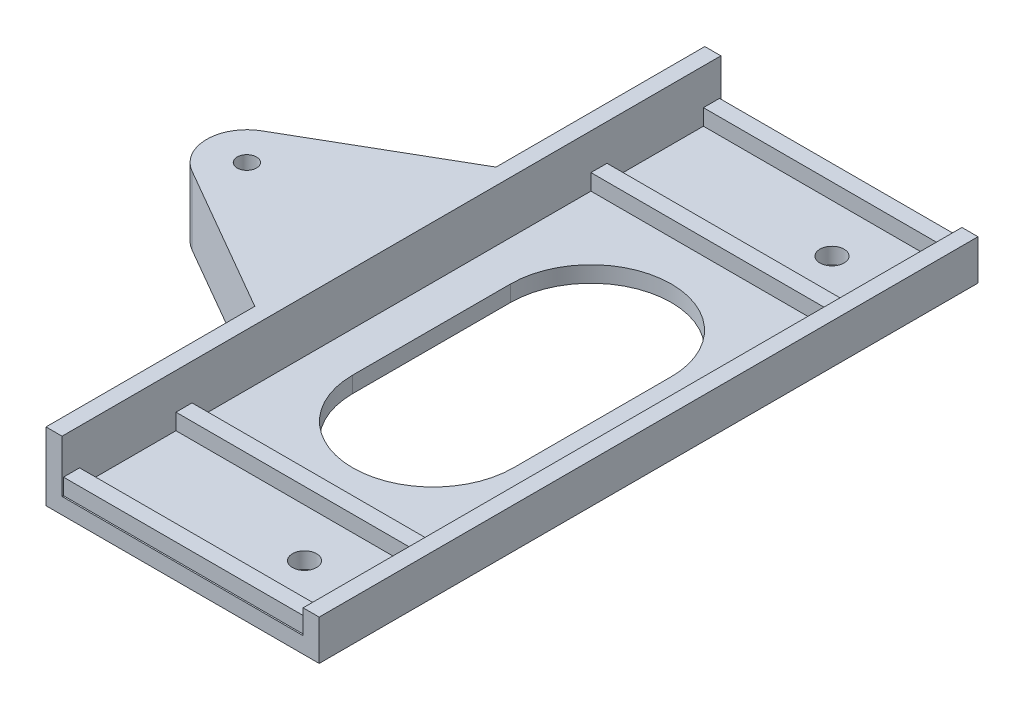
ISO-10303-21;
HEADER;
FILE_DESCRIPTION(('STEP AP214'),'2;1');
FILE_NAME('part.step','',(''),(''),'','','');
FILE_SCHEMA(('AUTOMOTIVE_DESIGN { 1 0 10303 214 1 1 1 1 }'));
ENDSEC;
DATA;
#1=APPLICATION_CONTEXT('core data for automotive mechanical design processes');
#2=APPLICATION_PROTOCOL_DEFINITION('international standard','automotive_design',2000,#1);
#3=PRODUCT_CONTEXT('',#1,'mechanical');
#4=PRODUCT('Part','Part','',(#3));
#5=PRODUCT_RELATED_PRODUCT_CATEGORY('part','',(#4));
#6=PRODUCT_DEFINITION_FORMATION('','',#4);
#7=PRODUCT_DEFINITION_CONTEXT('part definition',#1,'design');
#8=PRODUCT_DEFINITION('design','',#6,#7);
#9=PRODUCT_DEFINITION_SHAPE('','',#8);
#10=(LENGTH_UNIT() NAMED_UNIT(*) SI_UNIT(.MILLI.,.METRE.));
#11=(NAMED_UNIT(*) PLANE_ANGLE_UNIT() SI_UNIT($,.RADIAN.));
#12=(NAMED_UNIT(*) SI_UNIT($,.STERADIAN.) SOLID_ANGLE_UNIT());
#13=UNCERTAINTY_MEASURE_WITH_UNIT(LENGTH_MEASURE(1.E-05),#10,'distance_accuracy_value','');
#14=(GEOMETRIC_REPRESENTATION_CONTEXT(3) GLOBAL_UNCERTAINTY_ASSIGNED_CONTEXT((#13)) GLOBAL_UNIT_ASSIGNED_CONTEXT((#10,
#11,#12)) REPRESENTATION_CONTEXT('',''));
#15=CARTESIAN_POINT('',(0.,0.,0.));
#16=DIRECTION('',(0.,0.,1.));
#17=DIRECTION('',(1.,0.,0.));
#18=AXIS2_PLACEMENT_3D('',#15,#16,#17);
#19=CARTESIAN_POINT('',(-32.,0.,41.));
#20=DIRECTION('',(-1.,0.,0.));
#21=DIRECTION('',(0.,0.,1.));
#22=AXIS2_PLACEMENT_3D('',#19,#20,#21);
#23=PLANE('',#22);
#24=DIRECTION('',(0.,0.,-1.));
#25=VECTOR('',#24,1.);
#26=CARTESIAN_POINT('',(-32.,-2.,41.));
#27=LINE('',#26,#25);
#28=CARTESIAN_POINT('',(-32.,-2.00000000000001,-15.0111069989302));
#29=VERTEX_POINT('',#28);
#30=CARTESIAN_POINT('',(-32.,-2.,-41.));
#31=VERTEX_POINT('',#30);
#32=EDGE_CURVE('E269',#29,#31,#27,.T.);
#33=ORIENTED_EDGE('',*,*,#32,.F.);
#34=DIRECTION('',(0.,1.,0.));
#35=VECTOR('',#34,1.);
#36=CARTESIAN_POINT('',(-32.,-38.6378674779705,-15.0111069989302));
#37=LINE('',#36,#35);
#38=CARTESIAN_POINT('',(-32.,6.5,-15.0111069989302));
#39=VERTEX_POINT('',#38);
#40=EDGE_CURVE('E252',#29,#39,#37,.T.);
#41=ORIENTED_EDGE('',*,*,#40,.T.);
#42=DIRECTION('',(0.,0.,-1.));
#43=VECTOR('',#42,1.);
#44=CARTESIAN_POINT('',(-32.,6.5,41.));
#45=LINE('',#44,#43);
#46=CARTESIAN_POINT('',(-32.,6.5,-41.));
#47=VERTEX_POINT('',#46);
#48=EDGE_CURVE('E268',#39,#47,#45,.T.);
#49=ORIENTED_EDGE('',*,*,#48,.T.);
#50=DIRECTION('',(0.,1.,0.));
#51=VECTOR('',#50,1.);
#52=CARTESIAN_POINT('',(-32.,0.,-41.));
#53=LINE('',#52,#51);
#54=EDGE_CURVE('E329',#31,#47,#53,.T.);
#55=ORIENTED_EDGE('',*,*,#54,.F.);
#56=EDGE_LOOP('',(#33,#41,#49,#55));
#57=FACE_BOUND('',#56,.T.);
#58=ADVANCED_FACE('F32',(#57),#23,.T.);
#59=CARTESIAN_POINT('',(-30.,0.,41.));
#60=DIRECTION('',(-1.,0.,0.));
#61=DIRECTION('',(0.,0.,1.));
#62=AXIS2_PLACEMENT_3D('',#59,#60,#61);
#63=PLANE('',#62);
#64=DIRECTION('',(0.,-1.,0.));
#65=VECTOR('',#64,1.);
#66=CARTESIAN_POINT('',(-30.,2.,40.825));
#67=LINE('',#66,#65);
#68=CARTESIAN_POINT('',(-30.,2.,40.825));
#69=VERTEX_POINT('',#68);
#70=CARTESIAN_POINT('',(-30.,0.,40.825));
#71=VERTEX_POINT('',#70);
#72=EDGE_CURVE('E469',#69,#71,#67,.T.);
#73=ORIENTED_EDGE('',*,*,#72,.F.);
#74=DIRECTION('',(0.,0.,1.));
#75=VECTOR('',#74,1.);
#76=CARTESIAN_POINT('',(-30.,2.,40.825));
#77=LINE('',#76,#75);
#78=CARTESIAN_POINT('',(-30.,2.,38.825));
#79=VERTEX_POINT('',#78);
#80=EDGE_CURVE('E476',#79,#69,#77,.T.);
#81=ORIENTED_EDGE('',*,*,#80,.F.);
#82=DIRECTION('',(0.,-1.,0.));
#83=VECTOR('',#82,1.);
#84=CARTESIAN_POINT('',(-30.,2.,38.825));
#85=LINE('',#84,#83);
#86=CARTESIAN_POINT('',(-30.,0.,38.825));
#87=VERTEX_POINT('',#86);
#88=EDGE_CURVE('E475',#79,#87,#85,.T.);
#89=ORIENTED_EDGE('',*,*,#88,.T.);
#90=DIRECTION('',(0.,0.,-1.));
#91=VECTOR('',#90,1.);
#92=CARTESIAN_POINT('',(-30.,0.,41.));
#93=LINE('',#92,#91);
#94=CARTESIAN_POINT('',(-30.,0.,26.825));
#95=VERTEX_POINT('',#94);
#96=EDGE_CURVE('E359',#87,#95,#93,.T.);
#97=ORIENTED_EDGE('',*,*,#96,.T.);
#98=DIRECTION('',(0.,-1.,0.));
#99=VECTOR('',#98,1.);
#100=CARTESIAN_POINT('',(-30.,2.,26.825));
#101=LINE('',#100,#99);
#102=CARTESIAN_POINT('',(-30.,2.,26.825));
#103=VERTEX_POINT('',#102);
#104=EDGE_CURVE('E527',#103,#95,#101,.T.);
#105=ORIENTED_EDGE('',*,*,#104,.F.);
#106=DIRECTION('',(0.,0.,1.));
#107=VECTOR('',#106,1.);
#108=CARTESIAN_POINT('',(-30.,2.,26.825));
#109=LINE('',#108,#107);
#110=CARTESIAN_POINT('',(-30.,2.,24.825));
#111=VERTEX_POINT('',#110);
#112=EDGE_CURVE('E524',#111,#103,#109,.T.);
#113=ORIENTED_EDGE('',*,*,#112,.F.);
#114=DIRECTION('',(0.,-1.,0.));
#115=VECTOR('',#114,1.);
#116=CARTESIAN_POINT('',(-30.,2.,24.825));
#117=LINE('',#116,#115);
#118=CARTESIAN_POINT('',(-30.,0.,24.825));
#119=VERTEX_POINT('',#118);
#120=EDGE_CURVE('E534',#111,#119,#117,.T.);
#121=ORIENTED_EDGE('',*,*,#120,.T.);
#122=CARTESIAN_POINT('',(-30.,0.,-24.825));
#123=VERTEX_POINT('',#122);
#124=EDGE_CURVE('E402',#119,#123,#93,.T.);
#125=ORIENTED_EDGE('',*,*,#124,.T.);
#126=DIRECTION('',(0.,-1.,0.));
#127=VECTOR('',#126,1.);
#128=CARTESIAN_POINT('',(-30.,2.,-24.825));
#129=LINE('',#128,#127);
#130=CARTESIAN_POINT('',(-30.,2.,-24.825));
#131=VERTEX_POINT('',#130);
#132=EDGE_CURVE('E570',#131,#123,#129,.T.);
#133=ORIENTED_EDGE('',*,*,#132,.F.);
#134=DIRECTION('',(0.,0.,1.));
#135=VECTOR('',#134,1.);
#136=CARTESIAN_POINT('',(-30.,2.,-26.825));
#137=LINE('',#136,#135);
#138=CARTESIAN_POINT('',(-30.,2.,-26.825));
#139=VERTEX_POINT('',#138);
#140=EDGE_CURVE('E544',#139,#131,#137,.T.);
#141=ORIENTED_EDGE('',*,*,#140,.F.);
#142=DIRECTION('',(0.,-1.,0.));
#143=VECTOR('',#142,1.);
#144=CARTESIAN_POINT('',(-30.,2.,-26.825));
#145=LINE('',#144,#143);
#146=CARTESIAN_POINT('',(-30.,0.,-26.825));
#147=VERTEX_POINT('',#146);
#148=EDGE_CURVE('E557',#139,#147,#145,.T.);
#149=ORIENTED_EDGE('',*,*,#148,.T.);
#150=CARTESIAN_POINT('',(-30.,0.,-38.825));
#151=VERTEX_POINT('',#150);
#152=EDGE_CURVE('E360',#147,#151,#93,.T.);
#153=ORIENTED_EDGE('',*,*,#152,.T.);
#154=DIRECTION('',(0.,-1.,0.));
#155=VECTOR('',#154,1.);
#156=CARTESIAN_POINT('',(-30.,2.,-38.825));
#157=LINE('',#156,#155);
#158=CARTESIAN_POINT('',(-30.,2.,-38.825));
#159=VERTEX_POINT('',#158);
#160=EDGE_CURVE('E510',#159,#151,#157,.T.);
#161=ORIENTED_EDGE('',*,*,#160,.F.);
#162=DIRECTION('',(0.,0.,1.));
#163=VECTOR('',#162,1.);
#164=CARTESIAN_POINT('',(-30.,2.,-40.825));
#165=LINE('',#164,#163);
#166=CARTESIAN_POINT('',(-30.,2.,-40.825));
#167=VERTEX_POINT('',#166);
#168=EDGE_CURVE('E490',#167,#159,#165,.T.);
#169=ORIENTED_EDGE('',*,*,#168,.F.);
#170=DIRECTION('',(0.,-1.,0.));
#171=VECTOR('',#170,1.);
#172=CARTESIAN_POINT('',(-30.,2.,-40.825));
#173=LINE('',#172,#171);
#174=CARTESIAN_POINT('',(-30.,0.,-40.825));
#175=VERTEX_POINT('',#174);
#176=EDGE_CURVE('E399',#167,#175,#173,.T.);
#177=ORIENTED_EDGE('',*,*,#176,.T.);
#178=CARTESIAN_POINT('',(-30.,0.,-41.));
#179=VERTEX_POINT('',#178);
#180=EDGE_CURVE('E387',#175,#179,#93,.T.);
#181=ORIENTED_EDGE('',*,*,#180,.T.);
#182=DIRECTION('',(0.,1.,0.));
#183=VECTOR('',#182,1.);
#184=CARTESIAN_POINT('',(-30.,0.,-41.));
#185=LINE('',#184,#183);
#186=CARTESIAN_POINT('',(-30.,6.5,-41.));
#187=VERTEX_POINT('',#186);
#188=EDGE_CURVE('E388',#179,#187,#185,.T.);
#189=ORIENTED_EDGE('',*,*,#188,.T.);
#190=DIRECTION('',(0.,0.,-1.));
#191=VECTOR('',#190,1.);
#192=CARTESIAN_POINT('',(-30.,6.5,41.));
#193=LINE('',#192,#191);
#194=CARTESIAN_POINT('',(-30.,6.5,41.));
#195=VERTEX_POINT('',#194);
#196=EDGE_CURVE('E11',#195,#187,#193,.T.);
#197=ORIENTED_EDGE('',*,*,#196,.F.);
#198=DIRECTION('',(0.,1.,0.));
#199=VECTOR('',#198,1.);
#200=CARTESIAN_POINT('',(-30.,0.,41.));
#201=LINE('',#200,#199);
#202=CARTESIAN_POINT('',(-30.,0.,41.));
#203=VERTEX_POINT('',#202);
#204=EDGE_CURVE('E354',#203,#195,#201,.T.);
#205=ORIENTED_EDGE('',*,*,#204,.F.);
#206=EDGE_CURVE('E355',#203,#71,#93,.T.);
#207=ORIENTED_EDGE('',*,*,#206,.T.);
#208=EDGE_LOOP('',(#73,#81,#89,#97,#105,#113,#121,#125,#133,#141,#149,#153,#161,#169,#177,#181,
#189,#197,#205,#207));
#209=FACE_BOUND('',#208,.T.);
#210=ADVANCED_FACE('F34',(#209),#63,.F.);
#211=CARTESIAN_POINT('',(0.,3.,41.));
#212=DIRECTION('',(1.,0.,0.));
#213=DIRECTION('',(0.,1.,0.));
#214=AXIS2_PLACEMENT_3D('',#211,#212,#213);
#215=PLANE('',#214);
#216=DIRECTION('',(0.,-1.,0.));
#217=VECTOR('',#216,1.);
#218=CARTESIAN_POINT('',(0.,2.,40.825));
#219=LINE('',#218,#217);
#220=CARTESIAN_POINT('',(0.,2.,40.825));
#221=VERTEX_POINT('',#220);
#222=CARTESIAN_POINT('',(0.,0.,40.825));
#223=VERTEX_POINT('',#222);
#224=EDGE_CURVE('E487',#221,#223,#219,.T.);
#225=ORIENTED_EDGE('',*,*,#224,.T.);
#226=DIRECTION('',(0.,0.,-1.));
#227=VECTOR('',#226,1.);
#228=CARTESIAN_POINT('',(0.,0.,41.));
#229=LINE('',#228,#227);
#230=CARTESIAN_POINT('',(0.,0.,41.));
#231=VERTEX_POINT('',#230);
#232=EDGE_CURVE('E361',#231,#223,#229,.T.);
#233=ORIENTED_EDGE('',*,*,#232,.F.);
#234=DIRECTION('',(0.,-1.,0.));
#235=VECTOR('',#234,1.);
#236=CARTESIAN_POINT('',(0.,3.,41.));
#237=LINE('',#236,#235);
#238=CARTESIAN_POINT('',(0.,3.,41.));
#239=VERTEX_POINT('',#238);
#240=EDGE_CURVE('E378',#239,#231,#237,.T.);
#241=ORIENTED_EDGE('',*,*,#240,.F.);
#242=DIRECTION('',(0.,0.,-1.));
#243=VECTOR('',#242,1.);
#244=CARTESIAN_POINT('',(0.,3.,41.));
#245=LINE('',#244,#243);
#246=CARTESIAN_POINT('',(0.,3.,-41.));
#247=VERTEX_POINT('',#246);
#248=EDGE_CURVE('E364',#239,#247,#245,.T.);
#249=ORIENTED_EDGE('',*,*,#248,.T.);
#250=DIRECTION('',(0.,-1.,0.));
#251=VECTOR('',#250,1.);
#252=CARTESIAN_POINT('',(0.,3.,-41.));
#253=LINE('',#252,#251);
#254=CARTESIAN_POINT('',(0.,0.,-41.));
#255=VERTEX_POINT('',#254);
#256=EDGE_CURVE('E345',#247,#255,#253,.T.);
#257=ORIENTED_EDGE('',*,*,#256,.T.);
#258=CARTESIAN_POINT('',(0.,0.,-40.825));
#259=VERTEX_POINT('',#258);
#260=EDGE_CURVE('E358',#259,#255,#229,.T.);
#261=ORIENTED_EDGE('',*,*,#260,.F.);
#262=DIRECTION('',(0.,-1.,0.));
#263=VECTOR('',#262,1.);
#264=CARTESIAN_POINT('',(0.,2.,-40.825));
#265=LINE('',#264,#263);
#266=CARTESIAN_POINT('',(0.,2.,-40.825));
#267=VERTEX_POINT('',#266);
#268=EDGE_CURVE('E506',#267,#259,#265,.T.);
#269=ORIENTED_EDGE('',*,*,#268,.F.);
#270=DIRECTION('',(0.,0.,-1.));
#271=VECTOR('',#270,1.);
#272=CARTESIAN_POINT('',(0.,2.,-40.825));
#273=LINE('',#272,#271);
#274=CARTESIAN_POINT('',(0.,2.,-38.825));
#275=VERTEX_POINT('',#274);
#276=EDGE_CURVE('E496',#275,#267,#273,.T.);
#277=ORIENTED_EDGE('',*,*,#276,.F.);
#278=DIRECTION('',(0.,-1.,0.));
#279=VECTOR('',#278,1.);
#280=CARTESIAN_POINT('',(0.,2.,-38.825));
#281=LINE('',#280,#279);
#282=CARTESIAN_POINT('',(0.,0.,-38.825));
#283=VERTEX_POINT('',#282);
#284=EDGE_CURVE('E508',#275,#283,#281,.T.);
#285=ORIENTED_EDGE('',*,*,#284,.T.);
#286=CARTESIAN_POINT('',(0.,0.,-26.825));
#287=VERTEX_POINT('',#286);
#288=EDGE_CURVE('E366',#287,#283,#229,.T.);
#289=ORIENTED_EDGE('',*,*,#288,.F.);
#290=DIRECTION('',(0.,-1.,0.));
#291=VECTOR('',#290,1.);
#292=CARTESIAN_POINT('',(0.,2.,-26.825));
#293=LINE('',#292,#291);
#294=CARTESIAN_POINT('',(0.,2.,-26.825));
#295=VERTEX_POINT('',#294);
#296=EDGE_CURVE('E564',#295,#287,#293,.T.);
#297=ORIENTED_EDGE('',*,*,#296,.F.);
#298=DIRECTION('',(0.,0.,-1.));
#299=VECTOR('',#298,1.);
#300=CARTESIAN_POINT('',(0.,2.,-26.825));
#301=LINE('',#300,#299);
#302=CARTESIAN_POINT('',(0.,2.,-24.825));
#303=VERTEX_POINT('',#302);
#304=EDGE_CURVE('E551',#303,#295,#301,.T.);
#305=ORIENTED_EDGE('',*,*,#304,.F.);
#306=DIRECTION('',(0.,-1.,0.));
#307=VECTOR('',#306,1.);
#308=CARTESIAN_POINT('',(0.,2.,-24.825));
#309=LINE('',#308,#307);
#310=CARTESIAN_POINT('',(0.,0.,-24.825));
#311=VERTEX_POINT('',#310);
#312=EDGE_CURVE('E567',#303,#311,#309,.T.);
#313=ORIENTED_EDGE('',*,*,#312,.T.);
#314=CARTESIAN_POINT('',(0.,0.,24.825));
#315=VERTEX_POINT('',#314);
#316=EDGE_CURVE('E408',#315,#311,#229,.T.);
#317=ORIENTED_EDGE('',*,*,#316,.F.);
#318=DIRECTION('',(0.,-1.,0.));
#319=VECTOR('',#318,1.);
#320=CARTESIAN_POINT('',(0.,2.,24.825));
#321=LINE('',#320,#319);
#322=CARTESIAN_POINT('',(0.,2.,24.825));
#323=VERTEX_POINT('',#322);
#324=EDGE_CURVE('E537',#323,#315,#321,.T.);
#325=ORIENTED_EDGE('',*,*,#324,.F.);
#326=DIRECTION('',(0.,0.,-1.));
#327=VECTOR('',#326,1.);
#328=CARTESIAN_POINT('',(0.,2.,26.825));
#329=LINE('',#328,#327);
#330=CARTESIAN_POINT('',(0.,2.,26.825));
#331=VERTEX_POINT('',#330);
#332=EDGE_CURVE('E517',#331,#323,#329,.T.);
#333=ORIENTED_EDGE('',*,*,#332,.F.);
#334=DIRECTION('',(0.,-1.,0.));
#335=VECTOR('',#334,1.);
#336=CARTESIAN_POINT('',(0.,2.,26.825));
#337=LINE('',#336,#335);
#338=CARTESIAN_POINT('',(0.,0.,26.825));
#339=VERTEX_POINT('',#338);
#340=EDGE_CURVE('E540',#331,#339,#337,.T.);
#341=ORIENTED_EDGE('',*,*,#340,.T.);
#342=CARTESIAN_POINT('',(0.,0.,38.825));
#343=VERTEX_POINT('',#342);
#344=EDGE_CURVE('E365',#343,#339,#229,.T.);
#345=ORIENTED_EDGE('',*,*,#344,.F.);
#346=DIRECTION('',(0.,-1.,0.));
#347=VECTOR('',#346,1.);
#348=CARTESIAN_POINT('',(0.,2.,38.825));
#349=LINE('',#348,#347);
#350=CARTESIAN_POINT('',(0.,2.,38.825));
#351=VERTEX_POINT('',#350);
#352=EDGE_CURVE('E479',#351,#343,#349,.T.);
#353=ORIENTED_EDGE('',*,*,#352,.F.);
#354=DIRECTION('',(0.,0.,-1.));
#355=VECTOR('',#354,1.);
#356=CARTESIAN_POINT('',(0.,2.,40.825));
#357=LINE('',#356,#355);
#358=EDGE_CURVE('E600',#221,#351,#357,.T.);
#359=ORIENTED_EDGE('',*,*,#358,.F.);
#360=EDGE_LOOP('',(#225,#233,#241,#249,#257,#261,#269,#277,#285,#289,#297,#305,#313,#317,#325,
#333,#341,#345,#353,#359));
#361=FACE_BOUND('',#360,.T.);
#362=ADVANCED_FACE('F409',(#361),#215,.F.);
#363=CARTESIAN_POINT('',(0.,0.,41.));
#364=DIRECTION('',(0.,-1.,0.));
#365=DIRECTION('',(1.,0.,0.));
#366=AXIS2_PLACEMENT_3D('',#363,#364,#365);
#367=PLANE('',#366);
#368=DIRECTION('',(1.,0.,0.));
#369=VECTOR('',#368,1.);
#370=CARTESIAN_POINT('',(-30.,0.,40.825));
#371=LINE('',#370,#369);
#372=EDGE_CURVE('E462',#71,#223,#371,.T.);
#373=ORIENTED_EDGE('',*,*,#372,.F.);
#374=ORIENTED_EDGE('',*,*,#206,.F.);
#375=DIRECTION('',(-1.,0.,0.));
#376=VECTOR('',#375,1.);
#377=CARTESIAN_POINT('',(0.,0.,41.));
#378=LINE('',#377,#376);
#379=EDGE_CURVE('E385',#231,#203,#378,.T.);
#380=ORIENTED_EDGE('',*,*,#379,.F.);
#381=ORIENTED_EDGE('',*,*,#232,.T.);
#382=EDGE_LOOP('',(#373,#374,#380,#381));
#383=FACE_BOUND('',#382,.T.);
#384=ADVANCED_FACE('F444',(#383),#367,.F.);
#385=CARTESIAN_POINT('',(-8.,0.,32.825));
#386=DIRECTION('',(0.,1.,0.));
#387=DIRECTION('',(-1.,0.,0.));
#388=AXIS2_PLACEMENT_3D('',#385,#386,#387);
#389=CIRCLE('',#388,1.5);
#390=CARTESIAN_POINT('',(-9.5,0.,32.825));
#391=VERTEX_POINT('',#390);
#392=EDGE_CURVE('E577',#391,#391,#389,.T.);
#393=ORIENTED_EDGE('',*,*,#392,.F.);
#394=EDGE_LOOP('',(#393));
#395=FACE_BOUND('',#394,.T.);
#396=DIRECTION('',(-1.,0.,0.));
#397=VECTOR('',#396,1.);
#398=CARTESIAN_POINT('',(-30.,0.,38.825));
#399=LINE('',#398,#397);
#400=EDGE_CURVE('E466',#343,#87,#399,.T.);
#401=ORIENTED_EDGE('',*,*,#400,.F.);
#402=ORIENTED_EDGE('',*,*,#344,.T.);
#403=DIRECTION('',(1.,0.,0.));
#404=VECTOR('',#403,1.);
#405=CARTESIAN_POINT('',(-30.,0.,26.825));
#406=LINE('',#405,#404);
#407=EDGE_CURVE('E513',#95,#339,#406,.T.);
#408=ORIENTED_EDGE('',*,*,#407,.F.);
#409=ORIENTED_EDGE('',*,*,#96,.F.);
#410=EDGE_LOOP('',(#401,#402,#408,#409));
#411=FACE_BOUND('',#410,.T.);
#412=ADVANCED_FACE('F453',(#395,#411),#367,.F.);
#413=CARTESIAN_POINT('',(-8.,0.,-32.825));
#414=DIRECTION('',(0.,1.,0.));
#415=DIRECTION('',(1.,0.,0.));
#416=AXIS2_PLACEMENT_3D('',#413,#414,#415);
#417=CIRCLE('',#416,1.5);
#418=CARTESIAN_POINT('',(-6.5,0.,-32.825));
#419=VERTEX_POINT('',#418);
#420=EDGE_CURVE('E573',#419,#419,#417,.T.);
#421=ORIENTED_EDGE('',*,*,#420,.F.);
#422=EDGE_LOOP('',(#421));
#423=FACE_BOUND('',#422,.T.);
#424=DIRECTION('',(1.,0.,0.));
#425=VECTOR('',#424,1.);
#426=CARTESIAN_POINT('',(-30.,0.,-38.825));
#427=LINE('',#426,#425);
#428=EDGE_CURVE('E489',#151,#283,#427,.T.);
#429=ORIENTED_EDGE('',*,*,#428,.F.);
#430=ORIENTED_EDGE('',*,*,#152,.F.);
#431=DIRECTION('',(-1.,0.,0.));
#432=VECTOR('',#431,1.);
#433=CARTESIAN_POINT('',(-30.,0.,-26.825));
#434=LINE('',#433,#432);
#435=EDGE_CURVE('E548',#287,#147,#434,.T.);
#436=ORIENTED_EDGE('',*,*,#435,.F.);
#437=ORIENTED_EDGE('',*,*,#288,.T.);
#438=EDGE_LOOP('',(#429,#430,#436,#437));
#439=FACE_BOUND('',#438,.T.);
#440=ADVANCED_FACE('F448',(#423,#439),#367,.F.);
#441=DIRECTION('',(-1.,0.,0.));
#442=VECTOR('',#441,1.);
#443=CARTESIAN_POINT('',(-30.,0.,-40.825));
#444=LINE('',#443,#442);
#445=EDGE_CURVE('E405',#259,#175,#444,.T.);
#446=ORIENTED_EDGE('',*,*,#445,.F.);
#447=ORIENTED_EDGE('',*,*,#260,.T.);
#448=DIRECTION('',(-1.,0.,0.));
#449=VECTOR('',#448,1.);
#450=CARTESIAN_POINT('',(0.,0.,-41.));
#451=LINE('',#450,#449);
#452=EDGE_CURVE('E351',#255,#179,#451,.T.);
#453=ORIENTED_EDGE('',*,*,#452,.T.);
#454=ORIENTED_EDGE('',*,*,#180,.F.);
#455=EDGE_LOOP('',(#446,#447,#453,#454));
#456=FACE_BOUND('',#455,.T.);
#457=ADVANCED_FACE('F403',(#456),#367,.F.);
#458=DIRECTION('',(0.,0.,1.));
#459=VECTOR('',#458,1.);
#460=CARTESIAN_POINT('',(-25.,0.,-9.825));
#461=LINE('',#460,#459);
#462=CARTESIAN_POINT('',(-25.,0.,-9.82499999999999));
#463=VERTEX_POINT('',#462);
#464=CARTESIAN_POINT('',(-25.,0.,9.825));
#465=VERTEX_POINT('',#464);
#466=EDGE_CURVE('E620',#463,#465,#461,.T.);
#467=ORIENTED_EDGE('',*,*,#466,.F.);
#468=CARTESIAN_POINT('',(-15.,0.,-9.82499999999999));
#469=DIRECTION('',(0.,1.,0.));
#470=DIRECTION('',(-1.,0.,0.));
#471=AXIS2_PLACEMENT_3D('',#468,#469,#470);
#472=CIRCLE('',#471,10.);
#473=CARTESIAN_POINT('',(-5.,0.,-9.825));
#474=VERTEX_POINT('',#473);
#475=EDGE_CURVE('E57',#474,#463,#472,.T.);
#476=ORIENTED_EDGE('',*,*,#475,.F.);
#477=DIRECTION('',(0.,0.,-1.));
#478=VECTOR('',#477,1.);
#479=CARTESIAN_POINT('',(-5.,0.,-9.825));
#480=LINE('',#479,#478);
#481=CARTESIAN_POINT('',(-5.,0.,9.825));
#482=VERTEX_POINT('',#481);
#483=EDGE_CURVE('E613',#482,#474,#480,.T.);
#484=ORIENTED_EDGE('',*,*,#483,.F.);
#485=CARTESIAN_POINT('',(-15.,0.,9.82499999999999));
#486=DIRECTION('',(0.,1.,0.));
#487=DIRECTION('',(-1.,0.,0.));
#488=AXIS2_PLACEMENT_3D('',#485,#486,#487);
#489=CIRCLE('',#488,10.);
#490=EDGE_CURVE('E617',#465,#482,#489,.T.);
#491=ORIENTED_EDGE('',*,*,#490,.F.);
#492=EDGE_LOOP('',(#467,#476,#484,#491));
#493=FACE_BOUND('',#492,.T.);
#494=DIRECTION('',(-1.,0.,0.));
#495=VECTOR('',#494,1.);
#496=CARTESIAN_POINT('',(-30.,0.,24.825));
#497=LINE('',#496,#495);
#498=EDGE_CURVE('E518',#315,#119,#497,.T.);
#499=ORIENTED_EDGE('',*,*,#498,.F.);
#500=ORIENTED_EDGE('',*,*,#316,.T.);
#501=DIRECTION('',(1.,0.,0.));
#502=VECTOR('',#501,1.);
#503=CARTESIAN_POINT('',(-30.,0.,-24.825));
#504=LINE('',#503,#502);
#505=EDGE_CURVE('E543',#123,#311,#504,.T.);
#506=ORIENTED_EDGE('',*,*,#505,.F.);
#507=ORIENTED_EDGE('',*,*,#124,.F.);
#508=EDGE_LOOP('',(#499,#500,#506,#507));
#509=FACE_BOUND('',#508,.T.);
#510=ADVANCED_FACE('F438',(#493,#509),#367,.F.);
#511=CARTESIAN_POINT('',(-32.,6.5,41.));
#512=DIRECTION('',(0.,1.,0.));
#513=DIRECTION('',(0.,0.,1.));
#514=AXIS2_PLACEMENT_3D('',#511,#512,#513);
#515=PLANE('',#514);
#516=DIRECTION('',(1.,0.,0.));
#517=VECTOR('',#516,1.);
#518=CARTESIAN_POINT('',(-32.,6.5,-41.));
#519=LINE('',#518,#517);
#520=EDGE_CURVE('E324',#47,#187,#519,.T.);
#521=ORIENTED_EDGE('',*,*,#520,.F.);
#522=ORIENTED_EDGE('',*,*,#48,.F.);
#523=DIRECTION('',(-0.86602540378444,0.,0.499999999999998));
#524=VECTOR('',#523,1.);
#525=CARTESIAN_POINT('',(-50.5,6.5,-4.3301270189222));
#526=LINE('',#525,#524);
#527=CARTESIAN_POINT('',(-50.5,6.5,-4.3301270189222));
#528=VERTEX_POINT('',#527);
#529=EDGE_CURVE('E49',#39,#528,#526,.T.);
#530=ORIENTED_EDGE('',*,*,#529,.T.);
#531=CARTESIAN_POINT('',(-48.,6.5,0.));
#532=DIRECTION('',(0.,1.,0.));
#533=DIRECTION('',(0.,0.,1.));
#534=AXIS2_PLACEMENT_3D('',#531,#532,#533);
#535=CIRCLE('',#534,5.);
#536=CARTESIAN_POINT('',(-50.5,6.5,4.3301270189222));
#537=VERTEX_POINT('',#536);
#538=EDGE_CURVE('E304',#528,#537,#535,.T.);
#539=ORIENTED_EDGE('',*,*,#538,.T.);
#540=DIRECTION('',(0.86602540378444,0.,0.499999999999998));
#541=VECTOR('',#540,1.);
#542=CARTESIAN_POINT('',(-32.,6.5,15.0111069989302));
#543=LINE('',#542,#541);
#544=CARTESIAN_POINT('',(-32.,6.5,15.0111069989302));
#545=VERTEX_POINT('',#544);
#546=EDGE_CURVE('E286',#537,#545,#543,.T.);
#547=ORIENTED_EDGE('',*,*,#546,.T.);
#548=CARTESIAN_POINT('',(-32.,6.5,41.));
#549=VERTEX_POINT('',#548);
#550=EDGE_CURVE('E41',#549,#545,#45,.T.);
#551=ORIENTED_EDGE('',*,*,#550,.F.);
#552=DIRECTION('',(1.,0.,0.));
#553=VECTOR('',#552,1.);
#554=CARTESIAN_POINT('',(-32.,6.5,41.));
#555=LINE('',#554,#553);
#556=EDGE_CURVE('E585',#549,#195,#555,.T.);
#557=ORIENTED_EDGE('',*,*,#556,.T.);
#558=ORIENTED_EDGE('',*,*,#196,.T.);
#559=EDGE_LOOP('',(#521,#522,#530,#539,#547,#551,#557,#558));
#560=FACE_BOUND('',#559,.T.);
#561=CARTESIAN_POINT('',(-48.,6.5,0.));
#562=DIRECTION('',(0.,1.,0.));
#563=DIRECTION('',(0.,0.,1.));
#564=AXIS2_PLACEMENT_3D('',#561,#562,#563);
#565=CIRCLE('',#564,1.2);
#566=CARTESIAN_POINT('',(-48.,6.5,1.2));
#567=VERTEX_POINT('',#566);
#568=EDGE_CURVE('E260',#567,#567,#565,.T.);
#569=ORIENTED_EDGE('',*,*,#568,.F.);
#570=EDGE_LOOP('',(#569));
#571=FACE_BOUND('',#570,.T.);
#572=ADVANCED_FACE('F321',(#560,#571),#515,.T.);
#573=DIRECTION('',(0.,1.,0.));
#574=VECTOR('',#573,1.);
#575=CARTESIAN_POINT('',(-32.,-38.6378674779705,15.0111069989302));
#576=LINE('',#575,#574);
#577=CARTESIAN_POINT('',(-32.,-2.00000000000001,15.0111069989302));
#578=VERTEX_POINT('',#577);
#579=EDGE_CURVE('E246',#578,#545,#576,.T.);
#580=ORIENTED_EDGE('',*,*,#579,.F.);
#581=CARTESIAN_POINT('',(-32.,-2.,41.));
#582=VERTEX_POINT('',#581);
#583=EDGE_CURVE('E258',#582,#578,#27,.T.);
#584=ORIENTED_EDGE('',*,*,#583,.F.);
#585=DIRECTION('',(0.,1.,0.));
#586=VECTOR('',#585,1.);
#587=CARTESIAN_POINT('',(-32.,0.,41.));
#588=LINE('',#587,#586);
#589=EDGE_CURVE('E380',#582,#549,#588,.T.);
#590=ORIENTED_EDGE('',*,*,#589,.T.);
#591=ORIENTED_EDGE('',*,*,#550,.T.);
#592=EDGE_LOOP('',(#580,#584,#590,#591));
#593=FACE_BOUND('',#592,.T.);
#594=ADVANCED_FACE('F256',(#593),#23,.T.);
#595=CARTESIAN_POINT('',(0.,-2.,41.));
#596=DIRECTION('',(0.,-1.,0.));
#597=DIRECTION('',(1.,0.,0.));
#598=AXIS2_PLACEMENT_3D('',#595,#596,#597);
#599=PLANE('',#598);
#600=CARTESIAN_POINT('',(-15.,-2.00000000000001,-9.82499999999999));
#601=DIRECTION('',(0.,1.,0.));
#602=DIRECTION('',(-1.,0.,0.));
#603=AXIS2_PLACEMENT_3D('',#600,#601,#602);
#604=CIRCLE('',#603,10.);
#605=CARTESIAN_POINT('',(-5.,-2.00000000000001,-9.825));
#606=VERTEX_POINT('',#605);
#607=CARTESIAN_POINT('',(-25.,-2.00000000000001,-9.825));
#608=VERTEX_POINT('',#607);
#609=EDGE_CURVE('E616',#606,#608,#604,.T.);
#610=ORIENTED_EDGE('',*,*,#609,.T.);
#611=DIRECTION('',(0.,0.,1.));
#612=VECTOR('',#611,1.);
#613=CARTESIAN_POINT('',(-25.,-2.00000000000001,-9.825));
#614=LINE('',#613,#612);
#615=CARTESIAN_POINT('',(-25.,-2.,9.82499999999999));
#616=VERTEX_POINT('',#615);
#617=EDGE_CURVE('E629',#608,#616,#614,.T.);
#618=ORIENTED_EDGE('',*,*,#617,.T.);
#619=CARTESIAN_POINT('',(-15.,-2.00000000000001,9.82499999999999));
#620=DIRECTION('',(0.,1.,0.));
#621=DIRECTION('',(-1.,0.,0.));
#622=AXIS2_PLACEMENT_3D('',#619,#620,#621);
#623=CIRCLE('',#622,10.);
#624=CARTESIAN_POINT('',(-5.,-2.00000000000001,9.825));
#625=VERTEX_POINT('',#624);
#626=EDGE_CURVE('E626',#616,#625,#623,.T.);
#627=ORIENTED_EDGE('',*,*,#626,.T.);
#628=DIRECTION('',(0.,0.,-1.));
#629=VECTOR('',#628,1.);
#630=CARTESIAN_POINT('',(-5.,-2.00000000000001,-9.825));
#631=LINE('',#630,#629);
#632=EDGE_CURVE('E608',#625,#606,#631,.T.);
#633=ORIENTED_EDGE('',*,*,#632,.T.);
#634=EDGE_LOOP('',(#610,#618,#627,#633));
#635=FACE_BOUND('',#634,.T.);
#636=CARTESIAN_POINT('',(-8.,-2.,-32.825));
#637=DIRECTION('',(0.,1.,0.));
#638=DIRECTION('',(1.,0.,0.));
#639=AXIS2_PLACEMENT_3D('',#636,#637,#638);
#640=CIRCLE('',#639,1.5);
#641=CARTESIAN_POINT('',(-6.5,-2.,-32.825));
#642=VERTEX_POINT('',#641);
#643=EDGE_CURVE('E574',#642,#642,#640,.T.);
#644=ORIENTED_EDGE('',*,*,#643,.T.);
#645=EDGE_LOOP('',(#644));
#646=FACE_BOUND('',#645,.T.);
#647=CARTESIAN_POINT('',(-8.,-2.,32.825));
#648=DIRECTION('',(0.,1.,0.));
#649=DIRECTION('',(-1.,0.,0.));
#650=AXIS2_PLACEMENT_3D('',#647,#648,#649);
#651=CIRCLE('',#650,1.5);
#652=CARTESIAN_POINT('',(-9.5,-2.,32.825));
#653=VERTEX_POINT('',#652);
#654=EDGE_CURVE('E391',#653,#653,#651,.T.);
#655=ORIENTED_EDGE('',*,*,#654,.T.);
#656=EDGE_LOOP('',(#655));
#657=FACE_BOUND('',#656,.T.);
#658=DIRECTION('',(-1.,0.,0.));
#659=VECTOR('',#658,1.);
#660=CARTESIAN_POINT('',(0.,-2.,-41.));
#661=LINE('',#660,#659);
#662=CARTESIAN_POINT('',(2.,-2.,-41.));
#663=VERTEX_POINT('',#662);
#664=EDGE_CURVE('E331',#663,#31,#661,.T.);
#665=ORIENTED_EDGE('',*,*,#664,.F.);
#666=DIRECTION('',(0.,0.,-1.));
#667=VECTOR('',#666,1.);
#668=CARTESIAN_POINT('',(2.,-2.,41.));
#669=LINE('',#668,#667);
#670=CARTESIAN_POINT('',(2.,-2.,41.));
#671=VERTEX_POINT('',#670);
#672=EDGE_CURVE('E272',#671,#663,#669,.T.);
#673=ORIENTED_EDGE('',*,*,#672,.F.);
#674=DIRECTION('',(-1.,0.,0.));
#675=VECTOR('',#674,1.);
#676=CARTESIAN_POINT('',(0.,-2.,41.));
#677=LINE('',#676,#675);
#678=EDGE_CURVE('E267',#671,#582,#677,.T.);
#679=ORIENTED_EDGE('',*,*,#678,.T.);
#680=ORIENTED_EDGE('',*,*,#583,.T.);
#681=DIRECTION('',(0.86602540378444,0.,0.499999999999998));
#682=VECTOR('',#681,1.);
#683=CARTESIAN_POINT('',(-32.,-2.00000000000001,15.0111069989302));
#684=LINE('',#683,#682);
#685=CARTESIAN_POINT('',(-50.5,-2.00000000000001,4.3301270189222));
#686=VERTEX_POINT('',#685);
#687=EDGE_CURVE('E242',#686,#578,#684,.T.);
#688=ORIENTED_EDGE('',*,*,#687,.F.);
#689=CARTESIAN_POINT('',(-48.,-2.00000000000001,0.));
#690=DIRECTION('',(0.,-1.,0.));
#691=DIRECTION('',(1.,0.,0.));
#692=AXIS2_PLACEMENT_3D('',#689,#690,#691);
#693=CIRCLE('',#692,5.);
#694=CARTESIAN_POINT('',(-50.5,-2.00000000000001,-4.33012701892219));
#695=VERTEX_POINT('',#694);
#696=EDGE_CURVE('E313',#695,#686,#693,.F.);
#697=ORIENTED_EDGE('',*,*,#696,.F.);
#698=DIRECTION('',(-0.86602540378444,0.,0.499999999999998));
#699=VECTOR('',#698,1.);
#700=CARTESIAN_POINT('',(-50.5,-2.00000000000001,-4.3301270189222));
#701=LINE('',#700,#699);
#702=EDGE_CURVE('E292',#29,#695,#701,.T.);
#703=ORIENTED_EDGE('',*,*,#702,.F.);
#704=ORIENTED_EDGE('',*,*,#32,.T.);
#705=EDGE_LOOP('',(#665,#673,#679,#680,#688,#697,#703,#704));
#706=FACE_BOUND('',#705,.T.);
#707=CARTESIAN_POINT('',(-48.,-2.00000000000001,0.));
#708=DIRECTION('',(0.,-1.,0.));
#709=DIRECTION('',(1.,0.,0.));
#710=AXIS2_PLACEMENT_3D('',#707,#708,#709);
#711=CIRCLE('',#710,1.2);
#712=CARTESIAN_POINT('',(-46.8,-2.00000000000001,0.));
#713=VERTEX_POINT('',#712);
#714=EDGE_CURVE('E285',#713,#713,#711,.F.);
#715=ORIENTED_EDGE('',*,*,#714,.T.);
#716=EDGE_LOOP('',(#715));
#717=FACE_BOUND('',#716,.T.);
#718=ADVANCED_FACE('F264',(#635,#646,#657,#706,#717),#599,.T.);
#719=CARTESIAN_POINT('',(2.,3.,41.));
#720=DIRECTION('',(1.,0.,0.));
#721=DIRECTION('',(0.,1.,0.));
#722=AXIS2_PLACEMENT_3D('',#719,#720,#721);
#723=PLANE('',#722);
#724=DIRECTION('',(0.,-1.,0.));
#725=VECTOR('',#724,1.);
#726=CARTESIAN_POINT('',(2.,3.,-41.));
#727=LINE('',#726,#725);
#728=CARTESIAN_POINT('',(2.,3.,-41.));
#729=VERTEX_POINT('',#728);
#730=EDGE_CURVE('E334',#729,#663,#727,.T.);
#731=ORIENTED_EDGE('',*,*,#730,.F.);
#732=DIRECTION('',(0.,0.,-1.));
#733=VECTOR('',#732,1.);
#734=CARTESIAN_POINT('',(2.,3.,41.));
#735=LINE('',#734,#733);
#736=CARTESIAN_POINT('',(2.,3.,41.));
#737=VERTEX_POINT('',#736);
#738=EDGE_CURVE('E367',#737,#729,#735,.T.);
#739=ORIENTED_EDGE('',*,*,#738,.F.);
#740=DIRECTION('',(0.,-1.,0.));
#741=VECTOR('',#740,1.);
#742=CARTESIAN_POINT('',(2.,3.,41.));
#743=LINE('',#742,#741);
#744=EDGE_CURVE('E373',#737,#671,#743,.T.);
#745=ORIENTED_EDGE('',*,*,#744,.T.);
#746=ORIENTED_EDGE('',*,*,#672,.T.);
#747=EDGE_LOOP('',(#731,#739,#745,#746));
#748=FACE_BOUND('',#747,.T.);
#749=ADVANCED_FACE('F371',(#748),#723,.T.);
#750=CARTESIAN_POINT('',(0.,3.,41.));
#751=DIRECTION('',(0.,1.,0.));
#752=DIRECTION('',(0.,0.,1.));
#753=AXIS2_PLACEMENT_3D('',#750,#751,#752);
#754=PLANE('',#753);
#755=DIRECTION('',(1.,0.,0.));
#756=VECTOR('',#755,1.);
#757=CARTESIAN_POINT('',(0.,3.,-41.));
#758=LINE('',#757,#756);
#759=EDGE_CURVE('E342',#247,#729,#758,.T.);
#760=ORIENTED_EDGE('',*,*,#759,.F.);
#761=ORIENTED_EDGE('',*,*,#248,.F.);
#762=DIRECTION('',(1.,0.,0.));
#763=VECTOR('',#762,1.);
#764=CARTESIAN_POINT('',(0.,3.,41.));
#765=LINE('',#764,#763);
#766=EDGE_CURVE('E376',#239,#737,#765,.T.);
#767=ORIENTED_EDGE('',*,*,#766,.T.);
#768=ORIENTED_EDGE('',*,*,#738,.T.);
#769=EDGE_LOOP('',(#760,#761,#767,#768));
#770=FACE_BOUND('',#769,.T.);
#771=ADVANCED_FACE('F411',(#770),#754,.T.);
#772=CARTESIAN_POINT('',(0.,0.,41.));
#773=DIRECTION('',(0.,0.,-1.));
#774=DIRECTION('',(-1.,0.,0.));
#775=AXIS2_PLACEMENT_3D('',#772,#773,#774);
#776=PLANE('',#775);
#777=ORIENTED_EDGE('',*,*,#204,.T.);
#778=ORIENTED_EDGE('',*,*,#556,.F.);
#779=ORIENTED_EDGE('',*,*,#589,.F.);
#780=ORIENTED_EDGE('',*,*,#678,.F.);
#781=ORIENTED_EDGE('',*,*,#744,.F.);
#782=ORIENTED_EDGE('',*,*,#766,.F.);
#783=ORIENTED_EDGE('',*,*,#240,.T.);
#784=ORIENTED_EDGE('',*,*,#379,.T.);
#785=EDGE_LOOP('',(#777,#778,#779,#780,#781,#782,#783,#784));
#786=FACE_BOUND('',#785,.T.);
#787=ADVANCED_FACE('F414',(#786),#776,.F.);
#788=CARTESIAN_POINT('',(0.,0.,-41.));
#789=DIRECTION('',(0.,0.,-1.));
#790=DIRECTION('',(-1.,0.,0.));
#791=AXIS2_PLACEMENT_3D('',#788,#789,#790);
#792=PLANE('',#791);
#793=ORIENTED_EDGE('',*,*,#188,.F.);
#794=ORIENTED_EDGE('',*,*,#452,.F.);
#795=ORIENTED_EDGE('',*,*,#256,.F.);
#796=ORIENTED_EDGE('',*,*,#759,.T.);
#797=ORIENTED_EDGE('',*,*,#730,.T.);
#798=ORIENTED_EDGE('',*,*,#664,.T.);
#799=ORIENTED_EDGE('',*,*,#54,.T.);
#800=ORIENTED_EDGE('',*,*,#520,.T.);
#801=EDGE_LOOP('',(#793,#794,#795,#796,#797,#798,#799,#800));
#802=FACE_BOUND('',#801,.T.);
#803=ADVANCED_FACE('F339',(#802),#792,.T.);
#804=CARTESIAN_POINT('',(-8.,-2.,32.825));
#805=DIRECTION('',(0.,1.,0.));
#806=DIRECTION('',(-1.,0.,0.));
#807=AXIS2_PLACEMENT_3D('',#804,#805,#806);
#808=CYLINDRICAL_SURFACE('',#807,1.5);
#809=ORIENTED_EDGE('',*,*,#654,.F.);
#810=EDGE_LOOP('',(#809));
#811=FACE_BOUND('',#810,.T.);
#812=ORIENTED_EDGE('',*,*,#392,.T.);
#813=EDGE_LOOP('',(#812));
#814=FACE_BOUND('',#813,.T.);
#815=ADVANCED_FACE('F422',(#811,#814),#808,.F.);
#816=CARTESIAN_POINT('',(-8.,-2.,-32.825));
#817=DIRECTION('',(0.,1.,0.));
#818=DIRECTION('',(-1.,0.,0.));
#819=AXIS2_PLACEMENT_3D('',#816,#817,#818);
#820=CYLINDRICAL_SURFACE('',#819,1.5);
#821=ORIENTED_EDGE('',*,*,#643,.F.);
#822=EDGE_LOOP('',(#821));
#823=FACE_BOUND('',#822,.T.);
#824=ORIENTED_EDGE('',*,*,#420,.T.);
#825=EDGE_LOOP('',(#824));
#826=FACE_BOUND('',#825,.T.);
#827=ADVANCED_FACE('F702',(#823,#826),#820,.F.);
#828=CARTESIAN_POINT('',(-30.,2.,-24.825));
#829=DIRECTION('',(0.,0.,-1.));
#830=DIRECTION('',(-1.,0.,0.));
#831=AXIS2_PLACEMENT_3D('',#828,#829,#830);
#832=PLANE('',#831);
#833=ORIENTED_EDGE('',*,*,#505,.T.);
#834=ORIENTED_EDGE('',*,*,#312,.F.);
#835=DIRECTION('',(1.,0.,0.));
#836=VECTOR('',#835,1.);
#837=CARTESIAN_POINT('',(-30.,2.,-24.825));
#838=LINE('',#837,#836);
#839=EDGE_CURVE('E547',#131,#303,#838,.T.);
#840=ORIENTED_EDGE('',*,*,#839,.F.);
#841=ORIENTED_EDGE('',*,*,#132,.T.);
#842=EDGE_LOOP('',(#833,#834,#840,#841));
#843=FACE_BOUND('',#842,.T.);
#844=ADVANCED_FACE('F698',(#843),#832,.F.);
#845=CARTESIAN_POINT('',(-30.,2.,-26.825));
#846=DIRECTION('',(0.,0.,1.));
#847=DIRECTION('',(1.,0.,0.));
#848=AXIS2_PLACEMENT_3D('',#845,#846,#847);
#849=PLANE('',#848);
#850=ORIENTED_EDGE('',*,*,#435,.T.);
#851=ORIENTED_EDGE('',*,*,#148,.F.);
#852=DIRECTION('',(-1.,0.,0.));
#853=VECTOR('',#852,1.);
#854=CARTESIAN_POINT('',(-30.,2.,-26.825));
#855=LINE('',#854,#853);
#856=EDGE_CURVE('E554',#295,#139,#855,.T.);
#857=ORIENTED_EDGE('',*,*,#856,.F.);
#858=ORIENTED_EDGE('',*,*,#296,.T.);
#859=EDGE_LOOP('',(#850,#851,#857,#858));
#860=FACE_BOUND('',#859,.T.);
#861=ADVANCED_FACE('F694',(#860),#849,.F.);
#862=CARTESIAN_POINT('',(0.,2.,0.));
#863=DIRECTION('',(0.,1.,0.));
#864=DIRECTION('',(-1.,0.,0.));
#865=AXIS2_PLACEMENT_3D('',#862,#863,#864);
#866=PLANE('',#865);
#867=ORIENTED_EDGE('',*,*,#140,.T.);
#868=ORIENTED_EDGE('',*,*,#839,.T.);
#869=ORIENTED_EDGE('',*,*,#304,.T.);
#870=ORIENTED_EDGE('',*,*,#856,.T.);
#871=EDGE_LOOP('',(#867,#868,#869,#870));
#872=FACE_BOUND('',#871,.T.);
#873=ADVANCED_FACE('F690',(#872),#866,.T.);
#874=CARTESIAN_POINT('',(-30.,2.,26.825));
#875=DIRECTION('',(0.,0.,-1.));
#876=DIRECTION('',(-1.,0.,0.));
#877=AXIS2_PLACEMENT_3D('',#874,#875,#876);
#878=PLANE('',#877);
#879=ORIENTED_EDGE('',*,*,#407,.T.);
#880=ORIENTED_EDGE('',*,*,#340,.F.);
#881=DIRECTION('',(1.,0.,0.));
#882=VECTOR('',#881,1.);
#883=CARTESIAN_POINT('',(-30.,2.,26.825));
#884=LINE('',#883,#882);
#885=EDGE_CURVE('E514',#103,#331,#884,.T.);
#886=ORIENTED_EDGE('',*,*,#885,.F.);
#887=ORIENTED_EDGE('',*,*,#104,.T.);
#888=EDGE_LOOP('',(#879,#880,#886,#887));
#889=FACE_BOUND('',#888,.T.);
#890=ADVANCED_FACE('F686',(#889),#878,.F.);
#891=CARTESIAN_POINT('',(-30.,2.,24.825));
#892=DIRECTION('',(0.,0.,1.));
#893=DIRECTION('',(1.,0.,0.));
#894=AXIS2_PLACEMENT_3D('',#891,#892,#893);
#895=PLANE('',#894);
#896=ORIENTED_EDGE('',*,*,#498,.T.);
#897=ORIENTED_EDGE('',*,*,#120,.F.);
#898=DIRECTION('',(-1.,0.,0.));
#899=VECTOR('',#898,1.);
#900=CARTESIAN_POINT('',(-30.,2.,24.825));
#901=LINE('',#900,#899);
#902=EDGE_CURVE('E521',#323,#111,#901,.T.);
#903=ORIENTED_EDGE('',*,*,#902,.F.);
#904=ORIENTED_EDGE('',*,*,#324,.T.);
#905=EDGE_LOOP('',(#896,#897,#903,#904));
#906=FACE_BOUND('',#905,.T.);
#907=ADVANCED_FACE('F682',(#906),#895,.F.);
#908=CARTESIAN_POINT('',(0.,2.,0.));
#909=DIRECTION('',(0.,1.,0.));
#910=DIRECTION('',(-1.,0.,0.));
#911=AXIS2_PLACEMENT_3D('',#908,#909,#910);
#912=PLANE('',#911);
#913=ORIENTED_EDGE('',*,*,#885,.T.);
#914=ORIENTED_EDGE('',*,*,#332,.T.);
#915=ORIENTED_EDGE('',*,*,#902,.T.);
#916=ORIENTED_EDGE('',*,*,#112,.T.);
#917=EDGE_LOOP('',(#913,#914,#915,#916));
#918=FACE_BOUND('',#917,.T.);
#919=ADVANCED_FACE('F678',(#918),#912,.T.);
#920=CARTESIAN_POINT('',(-30.,2.,-38.825));
#921=DIRECTION('',(0.,0.,-1.));
#922=DIRECTION('',(-1.,0.,0.));
#923=AXIS2_PLACEMENT_3D('',#920,#921,#922);
#924=PLANE('',#923);
#925=ORIENTED_EDGE('',*,*,#428,.T.);
#926=ORIENTED_EDGE('',*,*,#284,.F.);
#927=DIRECTION('',(1.,0.,0.));
#928=VECTOR('',#927,1.);
#929=CARTESIAN_POINT('',(-30.,2.,-38.825));
#930=LINE('',#929,#928);
#931=EDGE_CURVE('E493',#159,#275,#930,.T.);
#932=ORIENTED_EDGE('',*,*,#931,.F.);
#933=ORIENTED_EDGE('',*,*,#160,.T.);
#934=EDGE_LOOP('',(#925,#926,#932,#933));
#935=FACE_BOUND('',#934,.T.);
#936=ADVANCED_FACE('F674',(#935),#924,.F.);
#937=CARTESIAN_POINT('',(-30.,2.,-40.825));
#938=DIRECTION('',(0.,0.,1.));
#939=DIRECTION('',(1.,0.,0.));
#940=AXIS2_PLACEMENT_3D('',#937,#938,#939);
#941=PLANE('',#940);
#942=ORIENTED_EDGE('',*,*,#445,.T.);
#943=ORIENTED_EDGE('',*,*,#176,.F.);
#944=DIRECTION('',(-1.,0.,0.));
#945=VECTOR('',#944,1.);
#946=CARTESIAN_POINT('',(-30.,2.,-40.825));
#947=LINE('',#946,#945);
#948=EDGE_CURVE('E499',#267,#167,#947,.T.);
#949=ORIENTED_EDGE('',*,*,#948,.F.);
#950=ORIENTED_EDGE('',*,*,#268,.T.);
#951=EDGE_LOOP('',(#942,#943,#949,#950));
#952=FACE_BOUND('',#951,.T.);
#953=ADVANCED_FACE('F670',(#952),#941,.F.);
#954=CARTESIAN_POINT('',(0.,2.,0.));
#955=DIRECTION('',(0.,1.,0.));
#956=DIRECTION('',(-1.,0.,0.));
#957=AXIS2_PLACEMENT_3D('',#954,#955,#956);
#958=PLANE('',#957);
#959=ORIENTED_EDGE('',*,*,#168,.T.);
#960=ORIENTED_EDGE('',*,*,#931,.T.);
#961=ORIENTED_EDGE('',*,*,#276,.T.);
#962=ORIENTED_EDGE('',*,*,#948,.T.);
#963=EDGE_LOOP('',(#959,#960,#961,#962));
#964=FACE_BOUND('',#963,.T.);
#965=ADVANCED_FACE('F667',(#964),#958,.T.);
#966=CARTESIAN_POINT('',(-30.,2.,40.825));
#967=DIRECTION('',(0.,0.,-1.));
#968=DIRECTION('',(-1.,0.,0.));
#969=AXIS2_PLACEMENT_3D('',#966,#967,#968);
#970=PLANE('',#969);
#971=ORIENTED_EDGE('',*,*,#372,.T.);
#972=ORIENTED_EDGE('',*,*,#224,.F.);
#973=DIRECTION('',(1.,0.,0.));
#974=VECTOR('',#973,1.);
#975=CARTESIAN_POINT('',(-30.,2.,40.825));
#976=LINE('',#975,#974);
#977=EDGE_CURVE('E474',#69,#221,#976,.T.);
#978=ORIENTED_EDGE('',*,*,#977,.F.);
#979=ORIENTED_EDGE('',*,*,#72,.T.);
#980=EDGE_LOOP('',(#971,#972,#978,#979));
#981=FACE_BOUND('',#980,.T.);
#982=ADVANCED_FACE('F472',(#981),#970,.F.);
#983=CARTESIAN_POINT('',(-30.,2.,38.825));
#984=DIRECTION('',(0.,0.,1.));
#985=DIRECTION('',(1.,0.,0.));
#986=AXIS2_PLACEMENT_3D('',#983,#984,#985);
#987=PLANE('',#986);
#988=ORIENTED_EDGE('',*,*,#400,.T.);
#989=ORIENTED_EDGE('',*,*,#88,.F.);
#990=DIRECTION('',(-1.,0.,0.));
#991=VECTOR('',#990,1.);
#992=CARTESIAN_POINT('',(-30.,2.,38.825));
#993=LINE('',#992,#991);
#994=EDGE_CURVE('E481',#351,#79,#993,.T.);
#995=ORIENTED_EDGE('',*,*,#994,.F.);
#996=ORIENTED_EDGE('',*,*,#352,.T.);
#997=EDGE_LOOP('',(#988,#989,#995,#996));
#998=FACE_BOUND('',#997,.T.);
#999=ADVANCED_FACE('F597',(#998),#987,.F.);
#1000=CARTESIAN_POINT('',(0.,2.,0.));
#1001=DIRECTION('',(0.,1.,0.));
#1002=DIRECTION('',(-1.,0.,0.));
#1003=AXIS2_PLACEMENT_3D('',#1000,#1001,#1002);
#1004=PLANE('',#1003);
#1005=ORIENTED_EDGE('',*,*,#977,.T.);
#1006=ORIENTED_EDGE('',*,*,#358,.T.);
#1007=ORIENTED_EDGE('',*,*,#994,.T.);
#1008=ORIENTED_EDGE('',*,*,#80,.T.);
#1009=EDGE_LOOP('',(#1005,#1006,#1007,#1008));
#1010=FACE_BOUND('',#1009,.T.);
#1011=ADVANCED_FACE('F653',(#1010),#1004,.T.);
#1012=CARTESIAN_POINT('',(-15.,-2.00000000000001,-9.82499999999999));
#1013=DIRECTION('',(0.,1.,0.));
#1014=DIRECTION('',(-1.,0.,0.));
#1015=AXIS2_PLACEMENT_3D('',#1012,#1013,#1014);
#1016=CYLINDRICAL_SURFACE('',#1015,10.);
#1017=ORIENTED_EDGE('',*,*,#475,.T.);
#1018=DIRECTION('',(0.,1.,0.));
#1019=VECTOR('',#1018,1.);
#1020=CARTESIAN_POINT('',(-25.,-2.00000000000001,-9.825));
#1021=LINE('',#1020,#1019);
#1022=EDGE_CURVE('E605',#608,#463,#1021,.T.);
#1023=ORIENTED_EDGE('',*,*,#1022,.F.);
#1024=ORIENTED_EDGE('',*,*,#609,.F.);
#1025=DIRECTION('',(0.,1.,0.));
#1026=VECTOR('',#1025,1.);
#1027=CARTESIAN_POINT('',(-5.,-2.00000000000001,-9.825));
#1028=LINE('',#1027,#1026);
#1029=EDGE_CURVE('E467',#606,#474,#1028,.T.);
#1030=ORIENTED_EDGE('',*,*,#1029,.T.);
#1031=EDGE_LOOP('',(#1017,#1023,#1024,#1030));
#1032=FACE_BOUND('',#1031,.T.);
#1033=ADVANCED_FACE('F636',(#1032),#1016,.F.);
#1034=CARTESIAN_POINT('',(-5.,-2.00000000000001,-9.825));
#1035=DIRECTION('',(1.,0.,0.));
#1036=DIRECTION('',(0.,1.,0.));
#1037=AXIS2_PLACEMENT_3D('',#1034,#1035,#1036);
#1038=PLANE('',#1037);
#1039=ORIENTED_EDGE('',*,*,#483,.T.);
#1040=ORIENTED_EDGE('',*,*,#1029,.F.);
#1041=ORIENTED_EDGE('',*,*,#632,.F.);
#1042=DIRECTION('',(0.,1.,0.));
#1043=VECTOR('',#1042,1.);
#1044=CARTESIAN_POINT('',(-5.,-2.00000000000001,9.825));
#1045=LINE('',#1044,#1043);
#1046=EDGE_CURVE('E610',#625,#482,#1045,.T.);
#1047=ORIENTED_EDGE('',*,*,#1046,.T.);
#1048=EDGE_LOOP('',(#1039,#1040,#1041,#1047));
#1049=FACE_BOUND('',#1048,.T.);
#1050=ADVANCED_FACE('F645',(#1049),#1038,.F.);
#1051=CARTESIAN_POINT('',(-15.,-2.00000000000001,9.82499999999999));
#1052=DIRECTION('',(0.,1.,0.));
#1053=DIRECTION('',(-1.,0.,0.));
#1054=AXIS2_PLACEMENT_3D('',#1051,#1052,#1053);
#1055=CYLINDRICAL_SURFACE('',#1054,10.);
#1056=ORIENTED_EDGE('',*,*,#490,.T.);
#1057=ORIENTED_EDGE('',*,*,#1046,.F.);
#1058=ORIENTED_EDGE('',*,*,#626,.F.);
#1059=DIRECTION('',(0.,1.,0.));
#1060=VECTOR('',#1059,1.);
#1061=CARTESIAN_POINT('',(-25.,-2.00000000000001,9.825));
#1062=LINE('',#1061,#1060);
#1063=EDGE_CURVE('E607',#616,#465,#1062,.T.);
#1064=ORIENTED_EDGE('',*,*,#1063,.T.);
#1065=EDGE_LOOP('',(#1056,#1057,#1058,#1064));
#1066=FACE_BOUND('',#1065,.T.);
#1067=ADVANCED_FACE('F642',(#1066),#1055,.F.);
#1068=CARTESIAN_POINT('',(-25.,-2.00000000000001,-9.825));
#1069=DIRECTION('',(-1.,0.,0.));
#1070=DIRECTION('',(0.,-1.,0.));
#1071=AXIS2_PLACEMENT_3D('',#1068,#1069,#1070);
#1072=PLANE('',#1071);
#1073=ORIENTED_EDGE('',*,*,#466,.T.);
#1074=ORIENTED_EDGE('',*,*,#1063,.F.);
#1075=ORIENTED_EDGE('',*,*,#617,.F.);
#1076=ORIENTED_EDGE('',*,*,#1022,.T.);
#1077=EDGE_LOOP('',(#1073,#1074,#1075,#1076));
#1078=FACE_BOUND('',#1077,.T.);
#1079=ADVANCED_FACE('F639',(#1078),#1072,.F.);
#1080=CARTESIAN_POINT('',(-48.,-38.6378674779705,0.));
#1081=DIRECTION('',(0.,1.,0.));
#1082=DIRECTION('',(0.,0.,1.));
#1083=AXIS2_PLACEMENT_3D('',#1080,#1081,#1082);
#1084=CYLINDRICAL_SURFACE('',#1083,5.);
#1085=DIRECTION('',(0.,1.,0.));
#1086=VECTOR('',#1085,1.);
#1087=CARTESIAN_POINT('',(-50.5,-38.6378674779705,-4.3301270189222));
#1088=LINE('',#1087,#1086);
#1089=EDGE_CURVE('E291',#695,#528,#1088,.T.);
#1090=ORIENTED_EDGE('',*,*,#1089,.F.);
#1091=ORIENTED_EDGE('',*,*,#696,.T.);
#1092=DIRECTION('',(0.,1.,0.));
#1093=VECTOR('',#1092,1.);
#1094=CARTESIAN_POINT('',(-50.5,-38.6378674779705,4.3301270189222));
#1095=LINE('',#1094,#1093);
#1096=EDGE_CURVE('E248',#686,#537,#1095,.T.);
#1097=ORIENTED_EDGE('',*,*,#1096,.T.);
#1098=ORIENTED_EDGE('',*,*,#538,.F.);
#1099=EDGE_LOOP('',(#1090,#1091,#1097,#1098));
#1100=FACE_BOUND('',#1099,.T.);
#1101=ADVANCED_FACE('F318',(#1100),#1084,.T.);
#1102=CARTESIAN_POINT('',(-50.5,-38.6378674779705,-4.3301270189222));
#1103=DIRECTION('',(-0.499999999999998,0.,-0.86602540378444));
#1104=DIRECTION('',(-0.86602540378444,0.,0.499999999999998));
#1105=AXIS2_PLACEMENT_3D('',#1102,#1103,#1104);
#1106=PLANE('',#1105);
#1107=ORIENTED_EDGE('',*,*,#40,.F.);
#1108=ORIENTED_EDGE('',*,*,#702,.T.);
#1109=ORIENTED_EDGE('',*,*,#1089,.T.);
#1110=ORIENTED_EDGE('',*,*,#529,.F.);
#1111=EDGE_LOOP('',(#1107,#1108,#1109,#1110));
#1112=FACE_BOUND('',#1111,.T.);
#1113=ADVANCED_FACE('F317',(#1112),#1106,.T.);
#1114=CARTESIAN_POINT('',(-32.,-38.6378674779705,15.0111069989302));
#1115=DIRECTION('',(-0.499999999999998,0.,0.86602540378444));
#1116=DIRECTION('',(0.86602540378444,0.,0.499999999999998));
#1117=AXIS2_PLACEMENT_3D('',#1114,#1115,#1116);
#1118=PLANE('',#1117);
#1119=ORIENTED_EDGE('',*,*,#1096,.F.);
#1120=ORIENTED_EDGE('',*,*,#687,.T.);
#1121=ORIENTED_EDGE('',*,*,#579,.T.);
#1122=ORIENTED_EDGE('',*,*,#546,.F.);
#1123=EDGE_LOOP('',(#1119,#1120,#1121,#1122));
#1124=FACE_BOUND('',#1123,.T.);
#1125=ADVANCED_FACE('F244',(#1124),#1118,.T.);
#1126=CARTESIAN_POINT('',(-48.,-38.6378674779705,0.));
#1127=DIRECTION('',(0.,1.,0.));
#1128=DIRECTION('',(0.,0.,1.));
#1129=AXIS2_PLACEMENT_3D('',#1126,#1127,#1128);
#1130=CYLINDRICAL_SURFACE('',#1129,1.2);
#1131=ORIENTED_EDGE('',*,*,#568,.T.);
#1132=EDGE_LOOP('',(#1131));
#1133=FACE_BOUND('',#1132,.T.);
#1134=ORIENTED_EDGE('',*,*,#714,.F.);
#1135=EDGE_LOOP('',(#1134));
#1136=FACE_BOUND('',#1135,.T.);
#1137=ADVANCED_FACE('F656',(#1133,#1136),#1130,.F.);
#1138=CLOSED_SHELL('',(#58,#210,#362,#384,#412,#440,#457,#510,#572,#594,#718,#749,#771,#787,
#803,#815,#827,#844,#861,#873,#890,#907,#919,#936,#953,#965,#982,#999,#1011,#1033,#1050,#1067,
#1079,#1101,#1113,#1125,#1137));
#1139=MANIFOLD_SOLID_BREP('B2',#1138);
#1140=ADVANCED_BREP_SHAPE_REPRESENTATION('',(#18,#1139),#14);
#1141=SHAPE_DEFINITION_REPRESENTATION(#9,#1140);
ENDSEC;
END-ISO-10303-21;
